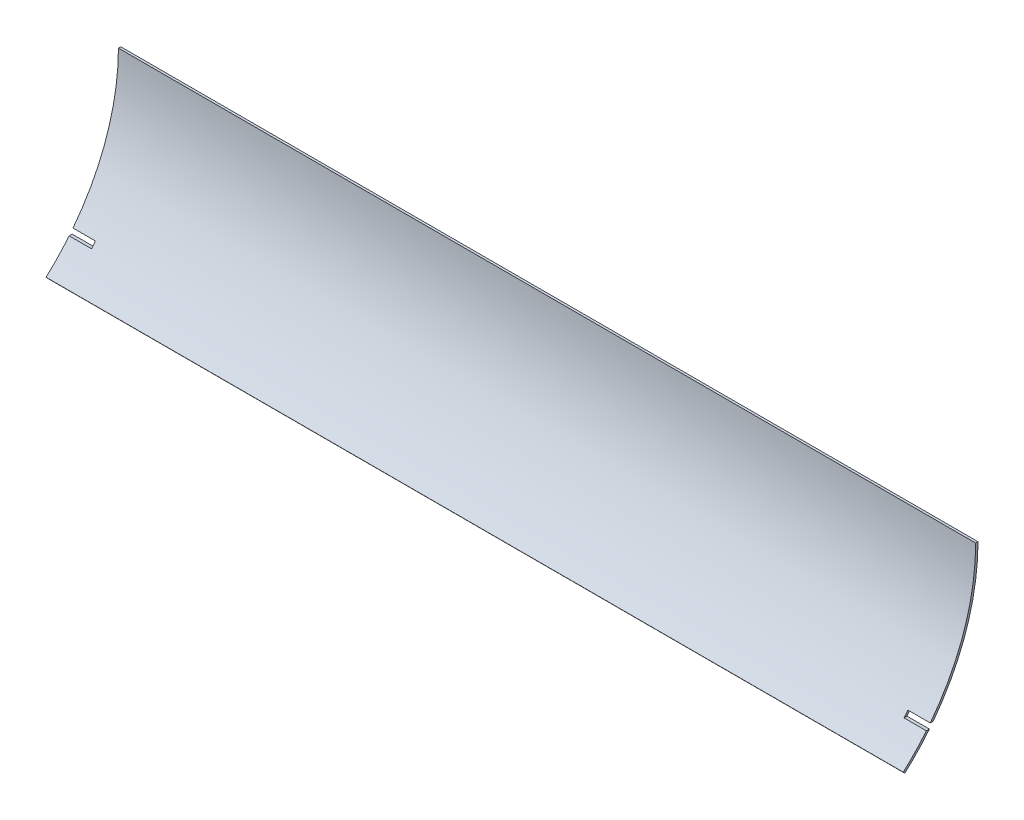
ISO-10303-21;
HEADER;
FILE_DESCRIPTION(('STEP AP214'),'2;1');
FILE_NAME('part.step','',(''),(''),'','','');
FILE_SCHEMA(('AUTOMOTIVE_DESIGN { 1 0 10303 214 1 1 1 1 }'));
ENDSEC;
DATA;
#1=APPLICATION_CONTEXT('core data for automotive mechanical design processes');
#2=APPLICATION_PROTOCOL_DEFINITION('international standard','automotive_design',2000,#1);
#3=PRODUCT_CONTEXT('',#1,'mechanical');
#4=PRODUCT('Part','Part','',(#3));
#5=PRODUCT_RELATED_PRODUCT_CATEGORY('part','',(#4));
#6=PRODUCT_DEFINITION_FORMATION('','',#4);
#7=PRODUCT_DEFINITION_CONTEXT('part definition',#1,'design');
#8=PRODUCT_DEFINITION('design','',#6,#7);
#9=PRODUCT_DEFINITION_SHAPE('','',#8);
#10=(LENGTH_UNIT() NAMED_UNIT(*) SI_UNIT(.MILLI.,.METRE.));
#11=(NAMED_UNIT(*) PLANE_ANGLE_UNIT() SI_UNIT($,.RADIAN.));
#12=(NAMED_UNIT(*) SI_UNIT($,.STERADIAN.) SOLID_ANGLE_UNIT());
#13=UNCERTAINTY_MEASURE_WITH_UNIT(LENGTH_MEASURE(1.E-05),#10,'distance_accuracy_value','');
#14=(GEOMETRIC_REPRESENTATION_CONTEXT(3) GLOBAL_UNCERTAINTY_ASSIGNED_CONTEXT((#13)) GLOBAL_UNIT_ASSIGNED_CONTEXT((#10,
#11,#12)) REPRESENTATION_CONTEXT('',''));
#15=CARTESIAN_POINT('',(0.,0.,0.));
#16=DIRECTION('',(0.,0.,1.));
#17=DIRECTION('',(1.,0.,0.));
#18=AXIS2_PLACEMENT_3D('',#15,#16,#17);
#19=CARTESIAN_POINT('',(584.2,0.,0.));
#20=DIRECTION('',(1.,0.,0.));
#21=DIRECTION('',(0.,0.,-1.));
#22=AXIS2_PLACEMENT_3D('',#19,#20,#21);
#23=PLANE('',#22);
#24=DIRECTION('',(0.,0.,1.));
#25=VECTOR('',#24,1.);
#26=CARTESIAN_POINT('',(584.2,-90.7219095744681,0.));
#27=LINE('',#26,#25);
#28=CARTESIAN_POINT('',(584.2,-90.7219095744681,-119.478703017419));
#29=VERTEX_POINT('',#28);
#30=CARTESIAN_POINT('',(584.2,-90.7219095744681,-117.479236887735));
#31=VERTEX_POINT('',#30);
#32=EDGE_CURVE('E41',#29,#31,#27,.T.);
#33=ORIENTED_EDGE('',*,*,#32,.F.);
#34=CARTESIAN_POINT('',(584.2,0.,0.));
#35=DIRECTION('',(1.,0.,0.));
#36=DIRECTION('',(0.,0.,-1.));
#37=AXIS2_PLACEMENT_3D('',#34,#35,#36);
#38=CIRCLE('',#37,150.01875);
#39=CARTESIAN_POINT('',(584.2,0.,-150.01875));
#40=VERTEX_POINT('',#39);
#41=EDGE_CURVE('E168',#29,#40,#38,.T.);
#42=ORIENTED_EDGE('',*,*,#41,.T.);
#43=DIRECTION('',(0.,0.,-1.));
#44=VECTOR('',#43,1.);
#45=CARTESIAN_POINT('',(584.2,0.,-148.43125));
#46=LINE('',#45,#44);
#47=CARTESIAN_POINT('',(584.2,0.,-148.43125));
#48=VERTEX_POINT('',#47);
#49=EDGE_CURVE('E167',#48,#40,#46,.T.);
#50=ORIENTED_EDGE('',*,*,#49,.F.);
#51=CARTESIAN_POINT('',(584.2,0.,0.));
#52=DIRECTION('',(1.,0.,0.));
#53=DIRECTION('',(0.,0.,-1.));
#54=AXIS2_PLACEMENT_3D('',#51,#52,#53);
#55=CIRCLE('',#54,148.43125);
#56=EDGE_CURVE('E171',#31,#48,#55,.T.);
#57=ORIENTED_EDGE('',*,*,#56,.F.);
#58=EDGE_LOOP('',(#33,#42,#50,#57));
#59=FACE_BOUND('',#58,.T.);
#60=ADVANCED_FACE('F33',(#59),#23,.T.);
#61=CARTESIAN_POINT('',(0.,0.,0.));
#62=DIRECTION('',(1.,0.,0.));
#63=DIRECTION('',(0.,0.,-1.));
#64=AXIS2_PLACEMENT_3D('',#61,#62,#63);
#65=PLANE('',#64);
#66=CARTESIAN_POINT('',(0.,0.,0.));
#67=DIRECTION('',(1.,0.,0.));
#68=DIRECTION('',(0.,0.,-1.));
#69=AXIS2_PLACEMENT_3D('',#66,#67,#68);
#70=CIRCLE('',#69,150.01875);
#71=CARTESIAN_POINT('',(0.,-90.7219095744681,-119.478703017419));
#72=VERTEX_POINT('',#71);
#73=CARTESIAN_POINT('',(0.,0.,-150.01875));
#74=VERTEX_POINT('',#73);
#75=EDGE_CURVE('E164',#72,#74,#70,.T.);
#76=ORIENTED_EDGE('',*,*,#75,.F.);
#77=DIRECTION('',(0.,0.,1.));
#78=VECTOR('',#77,1.);
#79=CARTESIAN_POINT('',(0.,-90.7219095744681,0.));
#80=LINE('',#79,#78);
#81=CARTESIAN_POINT('',(0.,-90.7219095744681,-117.479236887735));
#82=VERTEX_POINT('',#81);
#83=EDGE_CURVE('E203',#72,#82,#80,.T.);
#84=ORIENTED_EDGE('',*,*,#83,.T.);
#85=CARTESIAN_POINT('',(0.,0.,0.));
#86=DIRECTION('',(1.,0.,0.));
#87=DIRECTION('',(0.,0.,-1.));
#88=AXIS2_PLACEMENT_3D('',#85,#86,#87);
#89=CIRCLE('',#88,148.43125);
#90=CARTESIAN_POINT('',(0.,0.,-148.43125));
#91=VERTEX_POINT('',#90);
#92=EDGE_CURVE('E185',#82,#91,#89,.T.);
#93=ORIENTED_EDGE('',*,*,#92,.T.);
#94=DIRECTION('',(0.,0.,-1.));
#95=VECTOR('',#94,1.);
#96=CARTESIAN_POINT('',(0.,0.,-148.43125));
#97=LINE('',#96,#95);
#98=EDGE_CURVE('E182',#91,#74,#97,.T.);
#99=ORIENTED_EDGE('',*,*,#98,.T.);
#100=EDGE_LOOP('',(#76,#84,#93,#99));
#101=FACE_BOUND('',#100,.T.);
#102=ADVANCED_FACE('F227',(#101),#65,.F.);
#103=CARTESIAN_POINT('',(584.2,0.,0.));
#104=DIRECTION('',(-1.,0.,0.));
#105=DIRECTION('',(0.,0.,1.));
#106=AXIS2_PLACEMENT_3D('',#103,#104,#105);
#107=CYLINDRICAL_SURFACE('',#106,150.01875);
#108=ORIENTED_EDGE('',*,*,#41,.F.);
#109=DIRECTION('',(-1.,0.,0.));
#110=VECTOR('',#109,1.);
#111=CARTESIAN_POINT('',(584.2,-90.7219095744681,-119.478703017419));
#112=LINE('',#111,#110);
#113=CARTESIAN_POINT('',(568.96,-90.7219095744681,-119.478703017419));
#114=VERTEX_POINT('',#113);
#115=EDGE_CURVE('E142',#29,#114,#112,.T.);
#116=ORIENTED_EDGE('',*,*,#115,.T.);
#117=CARTESIAN_POINT('',(568.96,0.,0.));
#118=DIRECTION('',(-1.,0.,0.));
#119=DIRECTION('',(0.,0.,1.));
#120=AXIS2_PLACEMENT_3D('',#117,#118,#119);
#121=CIRCLE('',#120,150.01875);
#122=CARTESIAN_POINT('',(568.96,-94.0239095744681,-116.897946003746));
#123=VERTEX_POINT('',#122);
#124=EDGE_CURVE('E135',#114,#123,#121,.T.);
#125=ORIENTED_EDGE('',*,*,#124,.T.);
#126=DIRECTION('',(-1.,0.,0.));
#127=VECTOR('',#126,1.);
#128=CARTESIAN_POINT('',(584.2,-94.0239095744681,-116.897946003746));
#129=LINE('',#128,#127);
#130=CARTESIAN_POINT('',(584.2,-94.0239095744681,-116.897946003746));
#131=VERTEX_POINT('',#130);
#132=EDGE_CURVE('E121',#123,#131,#129,.F.);
#133=ORIENTED_EDGE('',*,*,#132,.T.);
#134=CARTESIAN_POINT('',(584.2,-111.716090425532,-100.125623551601));
#135=VERTEX_POINT('',#134);
#136=EDGE_CURVE('E165',#135,#131,#38,.T.);
#137=ORIENTED_EDGE('',*,*,#136,.F.);
#138=DIRECTION('',(-1.,0.,0.));
#139=VECTOR('',#138,1.);
#140=CARTESIAN_POINT('',(584.2,-111.716090425532,-100.125623551601));
#141=LINE('',#140,#139);
#142=CARTESIAN_POINT('',(0.,-111.716090425532,-100.125623551601));
#143=VERTEX_POINT('',#142);
#144=EDGE_CURVE('E178',#135,#143,#141,.T.);
#145=ORIENTED_EDGE('',*,*,#144,.T.);
#146=CARTESIAN_POINT('',(0.,-94.0239095744681,-116.897946003746));
#147=VERTEX_POINT('',#146);
#148=EDGE_CURVE('E179',#143,#147,#70,.T.);
#149=ORIENTED_EDGE('',*,*,#148,.T.);
#150=DIRECTION('',(-1.,0.,0.));
#151=VECTOR('',#150,1.);
#152=CARTESIAN_POINT('',(584.2,-94.0239095744676,-116.897946003747));
#153=LINE('',#152,#151);
#154=CARTESIAN_POINT('',(15.24,-94.0239095744681,-116.897946003747));
#155=VERTEX_POINT('',#154);
#156=EDGE_CURVE('E56',#147,#155,#153,.F.);
#157=ORIENTED_EDGE('',*,*,#156,.T.);
#158=CARTESIAN_POINT('',(15.24,0.,0.));
#159=DIRECTION('',(1.,0.,0.));
#160=DIRECTION('',(0.,1.,0.));
#161=AXIS2_PLACEMENT_3D('',#158,#159,#160);
#162=CIRCLE('',#161,150.01875);
#163=CARTESIAN_POINT('',(15.24,-90.7219095744681,-119.478703017419));
#164=VERTEX_POINT('',#163);
#165=EDGE_CURVE('E161',#155,#164,#162,.T.);
#166=ORIENTED_EDGE('',*,*,#165,.T.);
#167=DIRECTION('',(-1.,0.,0.));
#168=VECTOR('',#167,1.);
#169=CARTESIAN_POINT('',(584.2,-90.7219095744681,-119.478703017419));
#170=LINE('',#169,#168);
#171=EDGE_CURVE('E158',#164,#72,#170,.T.);
#172=ORIENTED_EDGE('',*,*,#171,.T.);
#173=ORIENTED_EDGE('',*,*,#75,.T.);
#174=DIRECTION('',(-1.,0.,0.));
#175=VECTOR('',#174,1.);
#176=CARTESIAN_POINT('',(584.2,0.,-150.01875));
#177=LINE('',#176,#175);
#178=EDGE_CURVE('E198',#40,#74,#177,.T.);
#179=ORIENTED_EDGE('',*,*,#178,.F.);
#180=EDGE_LOOP('',(#108,#116,#125,#133,#137,#145,#149,#157,#166,#172,#173,#179));
#181=FACE_BOUND('',#180,.T.);
#182=ADVANCED_FACE('F35',(#181),#107,.T.);
#183=CARTESIAN_POINT('',(584.2,0.,-148.43125));
#184=DIRECTION('',(0.,1.,0.));
#185=DIRECTION('',(0.,0.,1.));
#186=AXIS2_PLACEMENT_3D('',#183,#184,#185);
#187=PLANE('',#186);
#188=ORIENTED_EDGE('',*,*,#98,.F.);
#189=DIRECTION('',(-1.,0.,0.));
#190=VECTOR('',#189,1.);
#191=CARTESIAN_POINT('',(584.2,0.,-148.43125));
#192=LINE('',#191,#190);
#193=EDGE_CURVE('E195',#48,#91,#192,.T.);
#194=ORIENTED_EDGE('',*,*,#193,.F.);
#195=ORIENTED_EDGE('',*,*,#49,.T.);
#196=ORIENTED_EDGE('',*,*,#178,.T.);
#197=EDGE_LOOP('',(#188,#194,#195,#196));
#198=FACE_BOUND('',#197,.T.);
#199=ADVANCED_FACE('F221',(#198),#187,.T.);
#200=CARTESIAN_POINT('',(584.2,0.,0.));
#201=DIRECTION('',(-1.,0.,0.));
#202=DIRECTION('',(0.,0.,1.));
#203=AXIS2_PLACEMENT_3D('',#200,#201,#202);
#204=CYLINDRICAL_SURFACE('',#203,148.43125);
#205=DIRECTION('',(-1.,0.,0.));
#206=VECTOR('',#205,1.);
#207=CARTESIAN_POINT('',(584.2,-90.7219095744681,-117.479236887735));
#208=LINE('',#207,#206);
#209=CARTESIAN_POINT('',(568.96,-90.7219095744681,-117.479236887735));
#210=VERTEX_POINT('',#209);
#211=EDGE_CURVE('E130',#31,#210,#208,.T.);
#212=ORIENTED_EDGE('',*,*,#211,.F.);
#213=ORIENTED_EDGE('',*,*,#56,.T.);
#214=ORIENTED_EDGE('',*,*,#193,.T.);
#215=ORIENTED_EDGE('',*,*,#92,.F.);
#216=DIRECTION('',(-1.,0.,0.));
#217=VECTOR('',#216,1.);
#218=CARTESIAN_POINT('',(584.2,-90.7219095744681,-117.479236887735));
#219=LINE('',#218,#217);
#220=CARTESIAN_POINT('',(15.24,-90.7219095744681,-117.479236887735));
#221=VERTEX_POINT('',#220);
#222=EDGE_CURVE('E156',#221,#82,#219,.T.);
#223=ORIENTED_EDGE('',*,*,#222,.F.);
#224=CARTESIAN_POINT('',(15.24,0.,0.));
#225=DIRECTION('',(1.,0.,0.));
#226=DIRECTION('',(0.,1.,0.));
#227=AXIS2_PLACEMENT_3D('',#224,#225,#226);
#228=CIRCLE('',#227,148.43125);
#229=CARTESIAN_POINT('',(15.24,-94.0239095744681,-114.853560697502));
#230=VERTEX_POINT('',#229);
#231=EDGE_CURVE('E206',#230,#221,#228,.T.);
#232=ORIENTED_EDGE('',*,*,#231,.F.);
#233=DIRECTION('',(-1.,0.,0.));
#234=VECTOR('',#233,1.);
#235=CARTESIAN_POINT('',(584.2,-94.0239095744676,-114.853560697502));
#236=LINE('',#235,#234);
#237=CARTESIAN_POINT('',(0.,-94.0239095744681,-114.853560697502));
#238=VERTEX_POINT('',#237);
#239=EDGE_CURVE('E152',#238,#230,#236,.F.);
#240=ORIENTED_EDGE('',*,*,#239,.F.);
#241=CARTESIAN_POINT('',(0.,-110.533909574468,-99.0660931436473));
#242=VERTEX_POINT('',#241);
#243=EDGE_CURVE('E186',#242,#238,#89,.T.);
#244=ORIENTED_EDGE('',*,*,#243,.F.);
#245=DIRECTION('',(-1.,0.,0.));
#246=VECTOR('',#245,1.);
#247=CARTESIAN_POINT('',(584.2,-110.533909574468,-99.0660931436473));
#248=LINE('',#247,#246);
#249=CARTESIAN_POINT('',(584.2,-110.533909574468,-99.0660931436473));
#250=VERTEX_POINT('',#249);
#251=EDGE_CURVE('E193',#250,#242,#248,.T.);
#252=ORIENTED_EDGE('',*,*,#251,.F.);
#253=CARTESIAN_POINT('',(584.2,-94.0239095744681,-114.853560697502));
#254=VERTEX_POINT('',#253);
#255=EDGE_CURVE('E172',#250,#254,#55,.T.);
#256=ORIENTED_EDGE('',*,*,#255,.T.);
#257=DIRECTION('',(-1.,0.,0.));
#258=VECTOR('',#257,1.);
#259=CARTESIAN_POINT('',(584.2,-94.0239095744681,-114.853560697502));
#260=LINE('',#259,#258);
#261=CARTESIAN_POINT('',(568.96,-94.0239095744681,-114.853560697502));
#262=VERTEX_POINT('',#261);
#263=EDGE_CURVE('E48',#262,#254,#260,.F.);
#264=ORIENTED_EDGE('',*,*,#263,.F.);
#265=CARTESIAN_POINT('',(568.96,0.,0.));
#266=DIRECTION('',(-1.,0.,0.));
#267=DIRECTION('',(0.,0.,1.));
#268=AXIS2_PLACEMENT_3D('',#265,#266,#267);
#269=CIRCLE('',#268,148.43125);
#270=EDGE_CURVE('E11',#210,#262,#269,.T.);
#271=ORIENTED_EDGE('',*,*,#270,.F.);
#272=EDGE_LOOP('',(#212,#213,#214,#215,#223,#232,#240,#244,#252,#256,#264,#271));
#273=FACE_BOUND('',#272,.T.);
#274=ADVANCED_FACE('F215',(#273),#204,.F.);
#275=CARTESIAN_POINT('',(584.2,-111.716090425532,-100.125623551601));
#276=DIRECTION('',(0.,-0.66742072941949,0.744680851063834));
#277=DIRECTION('',(0.,-0.744680851063834,-0.66742072941949));
#278=AXIS2_PLACEMENT_3D('',#275,#276,#277);
#279=PLANE('',#278);
#280=DIRECTION('',(0.,0.744680851063834,0.66742072941949));
#281=VECTOR('',#280,1.);
#282=CARTESIAN_POINT('',(0.,-111.716090425532,-100.125623551601));
#283=LINE('',#282,#281);
#284=EDGE_CURVE('E189',#143,#242,#283,.T.);
#285=ORIENTED_EDGE('',*,*,#284,.F.);
#286=ORIENTED_EDGE('',*,*,#144,.F.);
#287=DIRECTION('',(0.,0.744680851063834,0.66742072941949));
#288=VECTOR('',#287,1.);
#289=CARTESIAN_POINT('',(584.2,-111.716090425532,-100.125623551601));
#290=LINE('',#289,#288);
#291=EDGE_CURVE('E175',#135,#250,#290,.T.);
#292=ORIENTED_EDGE('',*,*,#291,.T.);
#293=ORIENTED_EDGE('',*,*,#251,.T.);
#294=EDGE_LOOP('',(#285,#286,#292,#293));
#295=FACE_BOUND('',#294,.T.);
#296=ADVANCED_FACE('F241',(#295),#279,.T.);
#297=DIRECTION('',(0.,0.,-1.));
#298=VECTOR('',#297,1.);
#299=CARTESIAN_POINT('',(584.2,-94.0239095744681,0.));
#300=LINE('',#299,#298);
#301=EDGE_CURVE('E125',#254,#131,#300,.T.);
#302=ORIENTED_EDGE('',*,*,#301,.F.);
#303=ORIENTED_EDGE('',*,*,#255,.F.);
#304=ORIENTED_EDGE('',*,*,#291,.F.);
#305=ORIENTED_EDGE('',*,*,#136,.T.);
#306=EDGE_LOOP('',(#302,#303,#304,#305));
#307=FACE_BOUND('',#306,.T.);
#308=ADVANCED_FACE('F245',(#307),#23,.T.);
#309=ORIENTED_EDGE('',*,*,#243,.T.);
#310=DIRECTION('',(0.,0.,-1.));
#311=VECTOR('',#310,1.);
#312=CARTESIAN_POINT('',(0.,-94.0239095744681,0.));
#313=LINE('',#312,#311);
#314=EDGE_CURVE('E201',#238,#147,#313,.T.);
#315=ORIENTED_EDGE('',*,*,#314,.T.);
#316=ORIENTED_EDGE('',*,*,#148,.F.);
#317=ORIENTED_EDGE('',*,*,#284,.T.);
#318=EDGE_LOOP('',(#309,#315,#316,#317));
#319=FACE_BOUND('',#318,.T.);
#320=ADVANCED_FACE('F237',(#319),#65,.F.);
#321=CARTESIAN_POINT('',(15.24,-94.0239095744681,-150.01875));
#322=DIRECTION('',(1.,0.,0.));
#323=DIRECTION('',(0.,1.,0.));
#324=AXIS2_PLACEMENT_3D('',#321,#322,#323);
#325=PLANE('',#324);
#326=DIRECTION('',(0.,0.,1.));
#327=VECTOR('',#326,1.);
#328=CARTESIAN_POINT('',(15.24,-94.0239095744681,-150.01875));
#329=LINE('',#328,#327);
#330=EDGE_CURVE('E143',#155,#230,#329,.T.);
#331=ORIENTED_EDGE('',*,*,#330,.T.);
#332=ORIENTED_EDGE('',*,*,#231,.T.);
#333=DIRECTION('',(0.,0.,1.));
#334=VECTOR('',#333,1.);
#335=CARTESIAN_POINT('',(15.24,-90.7219095744681,-150.01875));
#336=LINE('',#335,#334);
#337=EDGE_CURVE('E146',#164,#221,#336,.T.);
#338=ORIENTED_EDGE('',*,*,#337,.F.);
#339=ORIENTED_EDGE('',*,*,#165,.F.);
#340=EDGE_LOOP('',(#331,#332,#338,#339));
#341=FACE_BOUND('',#340,.T.);
#342=ADVANCED_FACE('F232',(#341),#325,.F.);
#343=CARTESIAN_POINT('',(15.24,-90.7219095744681,-150.01875));
#344=DIRECTION('',(0.,1.,0.));
#345=DIRECTION('',(0.,0.,1.));
#346=AXIS2_PLACEMENT_3D('',#343,#344,#345);
#347=PLANE('',#346);
#348=ORIENTED_EDGE('',*,*,#337,.T.);
#349=ORIENTED_EDGE('',*,*,#222,.T.);
#350=ORIENTED_EDGE('',*,*,#83,.F.);
#351=ORIENTED_EDGE('',*,*,#171,.F.);
#352=EDGE_LOOP('',(#348,#349,#350,#351));
#353=FACE_BOUND('',#352,.T.);
#354=ADVANCED_FACE('F229',(#353),#347,.F.);
#355=CARTESIAN_POINT('',(0.,-94.0239095744681,-150.01875));
#356=DIRECTION('',(0.,-1.,0.));
#357=DIRECTION('',(1.,0.,0.));
#358=AXIS2_PLACEMENT_3D('',#355,#356,#357);
#359=PLANE('',#358);
#360=ORIENTED_EDGE('',*,*,#314,.F.);
#361=ORIENTED_EDGE('',*,*,#239,.T.);
#362=ORIENTED_EDGE('',*,*,#330,.F.);
#363=ORIENTED_EDGE('',*,*,#156,.F.);
#364=EDGE_LOOP('',(#360,#361,#362,#363));
#365=FACE_BOUND('',#364,.T.);
#366=ADVANCED_FACE('F233',(#365),#359,.F.);
#367=CARTESIAN_POINT('',(568.96,-94.0239095744681,-150.01875));
#368=DIRECTION('',(-1.,0.,0.));
#369=DIRECTION('',(0.,0.,1.));
#370=AXIS2_PLACEMENT_3D('',#367,#368,#369);
#371=PLANE('',#370);
#372=DIRECTION('',(0.,0.,1.));
#373=VECTOR('',#372,1.);
#374=CARTESIAN_POINT('',(568.96,-90.7219095744681,-150.01875));
#375=LINE('',#374,#373);
#376=EDGE_CURVE('E138',#114,#210,#375,.T.);
#377=ORIENTED_EDGE('',*,*,#376,.T.);
#378=ORIENTED_EDGE('',*,*,#270,.T.);
#379=DIRECTION('',(0.,0.,1.));
#380=VECTOR('',#379,1.);
#381=CARTESIAN_POINT('',(568.96,-94.0239095744681,-150.01875));
#382=LINE('',#381,#380);
#383=EDGE_CURVE('E124',#123,#262,#382,.T.);
#384=ORIENTED_EDGE('',*,*,#383,.F.);
#385=ORIENTED_EDGE('',*,*,#124,.F.);
#386=EDGE_LOOP('',(#377,#378,#384,#385));
#387=FACE_BOUND('',#386,.T.);
#388=ADVANCED_FACE('F134',(#387),#371,.F.);
#389=CARTESIAN_POINT('',(568.96,-90.7219095744681,-150.01875));
#390=DIRECTION('',(0.,1.,0.));
#391=DIRECTION('',(0.,0.,1.));
#392=AXIS2_PLACEMENT_3D('',#389,#390,#391);
#393=PLANE('',#392);
#394=ORIENTED_EDGE('',*,*,#32,.T.);
#395=ORIENTED_EDGE('',*,*,#211,.T.);
#396=ORIENTED_EDGE('',*,*,#376,.F.);
#397=ORIENTED_EDGE('',*,*,#115,.F.);
#398=EDGE_LOOP('',(#394,#395,#396,#397));
#399=FACE_BOUND('',#398,.T.);
#400=ADVANCED_FACE('F211',(#399),#393,.F.);
#401=CARTESIAN_POINT('',(584.2,-94.0239095744681,-150.01875));
#402=DIRECTION('',(0.,-1.,0.));
#403=DIRECTION('',(1.,0.,0.));
#404=AXIS2_PLACEMENT_3D('',#401,#402,#403);
#405=PLANE('',#404);
#406=ORIENTED_EDGE('',*,*,#383,.T.);
#407=ORIENTED_EDGE('',*,*,#263,.T.);
#408=ORIENTED_EDGE('',*,*,#301,.T.);
#409=ORIENTED_EDGE('',*,*,#132,.F.);
#410=EDGE_LOOP('',(#406,#407,#408,#409));
#411=FACE_BOUND('',#410,.T.);
#412=ADVANCED_FACE('F123',(#411),#405,.F.);
#413=CLOSED_SHELL('',(#60,#102,#182,#199,#274,#296,#308,#320,#342,#354,#366,#388,#400,#412));
#414=MANIFOLD_SOLID_BREP('B2',#413);
#415=ADVANCED_BREP_SHAPE_REPRESENTATION('',(#18,#414),#14);
#416=SHAPE_DEFINITION_REPRESENTATION(#9,#415);
ENDSEC;
END-ISO-10303-21;
